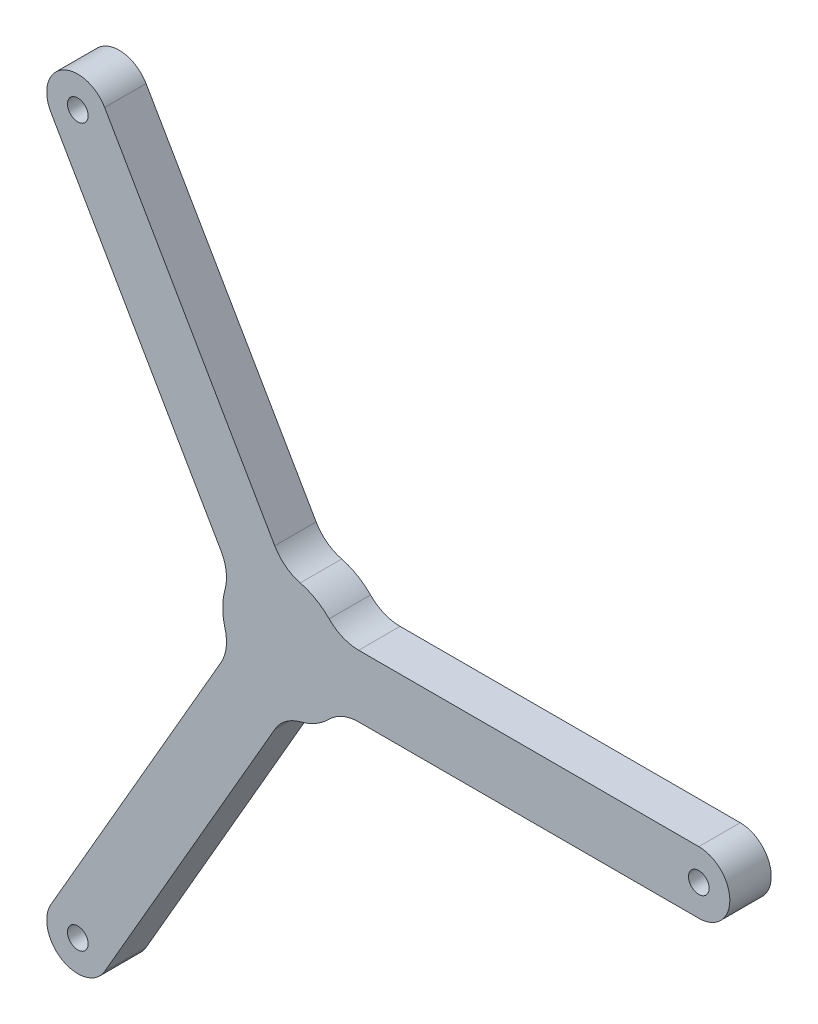
ISO-10303-21;
HEADER;
FILE_DESCRIPTION(('STEP AP214'),'2;1');
FILE_NAME('part.step','',(''),(''),'','','');
FILE_SCHEMA(('AUTOMOTIVE_DESIGN { 1 0 10303 214 1 1 1 1 }'));
ENDSEC;
DATA;
#1=APPLICATION_CONTEXT('core data for automotive mechanical design processes');
#2=APPLICATION_PROTOCOL_DEFINITION('international standard','automotive_design',2000,#1);
#3=PRODUCT_CONTEXT('',#1,'mechanical');
#4=PRODUCT('Part','Part','',(#3));
#5=PRODUCT_RELATED_PRODUCT_CATEGORY('part','',(#4));
#6=PRODUCT_DEFINITION_FORMATION('','',#4);
#7=PRODUCT_DEFINITION_CONTEXT('part definition',#1,'design');
#8=PRODUCT_DEFINITION('design','',#6,#7);
#9=PRODUCT_DEFINITION_SHAPE('','',#8);
#10=(LENGTH_UNIT() NAMED_UNIT(*) SI_UNIT(.MILLI.,.METRE.));
#11=(NAMED_UNIT(*) PLANE_ANGLE_UNIT() SI_UNIT($,.RADIAN.));
#12=(NAMED_UNIT(*) SI_UNIT($,.STERADIAN.) SOLID_ANGLE_UNIT());
#13=UNCERTAINTY_MEASURE_WITH_UNIT(LENGTH_MEASURE(1.E-05),#10,'distance_accuracy_value','');
#14=(GEOMETRIC_REPRESENTATION_CONTEXT(3) GLOBAL_UNCERTAINTY_ASSIGNED_CONTEXT((#13)) GLOBAL_UNIT_ASSIGNED_CONTEXT((#10,
#11,#12)) REPRESENTATION_CONTEXT('',''));
#15=CARTESIAN_POINT('',(0.,0.,0.));
#16=DIRECTION('',(0.,0.,1.));
#17=DIRECTION('',(1.,0.,0.));
#18=AXIS2_PLACEMENT_3D('',#15,#16,#17);
#19=CARTESIAN_POINT('',(0.,0.,10.));
#20=DIRECTION('',(0.,0.,-1.));
#21=DIRECTION('',(-1.,0.,0.));
#22=AXIS2_PLACEMENT_3D('',#19,#20,#21);
#23=CYLINDRICAL_SURFACE('',#22,15.);
#24=DIRECTION('',(0.,0.,-1.));
#25=VECTOR('',#24,1.);
#26=CARTESIAN_POINT('',(-14.4493380611438,-4.02698765763967,10.));
#27=LINE('',#26,#25);
#28=CARTESIAN_POINT('',(-14.4493380611438,-4.02698765763967,0.));
#29=VERTEX_POINT('',#28);
#30=CARTESIAN_POINT('',(-14.4493380611438,-4.02698765763967,10.));
#31=VERTEX_POINT('',#30);
#32=EDGE_CURVE('E59',#29,#31,#27,.F.);
#33=ORIENTED_EDGE('',*,*,#32,.T.);
#34=CARTESIAN_POINT('',(0.,0.,10.));
#35=DIRECTION('',(0.,0.,1.));
#36=DIRECTION('',(1.,0.,0.));
#37=AXIS2_PLACEMENT_3D('',#34,#35,#36);
#38=CIRCLE('',#37,15.);
#39=CARTESIAN_POINT('',(-14.4493380611437,4.02698765763987,10.));
#40=VERTEX_POINT('',#39);
#41=EDGE_CURVE('E277',#40,#31,#38,.T.);
#42=ORIENTED_EDGE('',*,*,#41,.F.);
#43=DIRECTION('',(0.,0.,-1.));
#44=VECTOR('',#43,1.);
#45=CARTESIAN_POINT('',(-14.4493380611437,4.02698765763987,10.));
#46=LINE('',#45,#44);
#47=CARTESIAN_POINT('',(-14.4493380611437,4.02698765763987,0.));
#48=VERTEX_POINT('',#47);
#49=EDGE_CURVE('E205',#40,#48,#46,.T.);
#50=ORIENTED_EDGE('',*,*,#49,.T.);
#51=CARTESIAN_POINT('',(0.,0.,0.));
#52=DIRECTION('',(0.,0.,1.));
#53=DIRECTION('',(1.,0.,0.));
#54=AXIS2_PLACEMENT_3D('',#51,#52,#53);
#55=CIRCLE('',#54,15.);
#56=EDGE_CURVE('E291',#48,#29,#55,.T.);
#57=ORIENTED_EDGE('',*,*,#56,.T.);
#58=EDGE_LOOP('',(#33,#42,#50,#57));
#59=FACE_BOUND('',#58,.T.);
#60=ADVANCED_FACE('F36',(#59),#23,.T.);
#61=DIRECTION('',(0.,0.,-1.));
#62=VECTOR('',#61,1.);
#63=CARTESIAN_POINT('',(3.7371954183296,14.5269876576397,10.));
#64=LINE('',#63,#62);
#65=CARTESIAN_POINT('',(3.7371954183296,14.5269876576397,0.));
#66=VERTEX_POINT('',#65);
#67=CARTESIAN_POINT('',(3.7371954183296,14.5269876576397,10.));
#68=VERTEX_POINT('',#67);
#69=EDGE_CURVE('E172',#66,#68,#64,.F.);
#70=ORIENTED_EDGE('',*,*,#69,.T.);
#71=CARTESIAN_POINT('',(10.7121426428143,10.5,10.));
#72=VERTEX_POINT('',#71);
#73=EDGE_CURVE('E274',#72,#68,#38,.T.);
#74=ORIENTED_EDGE('',*,*,#73,.F.);
#75=DIRECTION('',(0.,0.,-1.));
#76=VECTOR('',#75,1.);
#77=CARTESIAN_POINT('',(10.7121426428143,10.5,10.));
#78=LINE('',#77,#76);
#79=CARTESIAN_POINT('',(10.7121426428143,10.5,0.));
#80=VERTEX_POINT('',#79);
#81=EDGE_CURVE('E300',#72,#80,#78,.T.);
#82=ORIENTED_EDGE('',*,*,#81,.T.);
#83=EDGE_CURVE('E289',#80,#66,#55,.T.);
#84=ORIENTED_EDGE('',*,*,#83,.T.);
#85=EDGE_LOOP('',(#70,#74,#82,#84));
#86=FACE_BOUND('',#85,.T.);
#87=ADVANCED_FACE('F361',(#86),#23,.T.);
#88=CARTESIAN_POINT('',(0.,-7.5,10.));
#89=DIRECTION('',(0.,-1.,0.));
#90=DIRECTION('',(1.,0.,0.));
#91=AXIS2_PLACEMENT_3D('',#88,#89,#90);
#92=PLANE('',#91);
#93=DIRECTION('',(-1.,0.,0.));
#94=VECTOR('',#93,1.);
#95=CARTESIAN_POINT('',(0.,-7.5,10.));
#96=LINE('',#95,#94);
#97=CARTESIAN_POINT('',(100.,-7.5,10.));
#98=VERTEX_POINT('',#97);
#99=CARTESIAN_POINT('',(17.8535710713571,-7.5,10.));
#100=VERTEX_POINT('',#99);
#101=EDGE_CURVE('E265',#98,#100,#96,.T.);
#102=ORIENTED_EDGE('',*,*,#101,.T.);
#103=DIRECTION('',(0.,0.,-1.));
#104=VECTOR('',#103,1.);
#105=CARTESIAN_POINT('',(17.8535710713571,-7.5,10.));
#106=LINE('',#105,#104);
#107=CARTESIAN_POINT('',(17.8535710713571,-7.5,0.));
#108=VERTEX_POINT('',#107);
#109=EDGE_CURVE('E305',#100,#108,#106,.T.);
#110=ORIENTED_EDGE('',*,*,#109,.T.);
#111=DIRECTION('',(-1.,0.,0.));
#112=VECTOR('',#111,1.);
#113=CARTESIAN_POINT('',(0.,-7.5,0.));
#114=LINE('',#113,#112);
#115=CARTESIAN_POINT('',(100.,-7.5,0.));
#116=VERTEX_POINT('',#115);
#117=EDGE_CURVE('E264',#116,#108,#114,.T.);
#118=ORIENTED_EDGE('',*,*,#117,.F.);
#119=DIRECTION('',(0.,0.,-1.));
#120=VECTOR('',#119,1.);
#121=CARTESIAN_POINT('',(100.,-7.5,10.));
#122=LINE('',#121,#120);
#123=EDGE_CURVE('E296',#98,#116,#122,.T.);
#124=ORIENTED_EDGE('',*,*,#123,.F.);
#125=EDGE_LOOP('',(#102,#110,#118,#124));
#126=FACE_BOUND('',#125,.T.);
#127=ADVANCED_FACE('F366',(#126),#92,.T.);
#128=CARTESIAN_POINT('',(100.,0.,10.));
#129=DIRECTION('',(0.,0.,-1.));
#130=DIRECTION('',(-1.,0.,0.));
#131=AXIS2_PLACEMENT_3D('',#128,#129,#130);
#132=CYLINDRICAL_SURFACE('',#131,7.5);
#133=CARTESIAN_POINT('',(100.,0.,0.));
#134=DIRECTION('',(0.,0.,1.));
#135=DIRECTION('',(1.,0.,0.));
#136=AXIS2_PLACEMENT_3D('',#133,#134,#135);
#137=CIRCLE('',#136,7.5);
#138=CARTESIAN_POINT('',(100.,7.5,0.));
#139=VERTEX_POINT('',#138);
#140=EDGE_CURVE('E283',#116,#139,#137,.T.);
#141=ORIENTED_EDGE('',*,*,#140,.T.);
#142=DIRECTION('',(0.,0.,-1.));
#143=VECTOR('',#142,1.);
#144=CARTESIAN_POINT('',(100.,7.5,10.));
#145=LINE('',#144,#143);
#146=CARTESIAN_POINT('',(100.,7.5,10.));
#147=VERTEX_POINT('',#146);
#148=EDGE_CURVE('E280',#147,#139,#145,.T.);
#149=ORIENTED_EDGE('',*,*,#148,.F.);
#150=CARTESIAN_POINT('',(100.,0.,10.));
#151=DIRECTION('',(0.,0.,1.));
#152=DIRECTION('',(1.,0.,0.));
#153=AXIS2_PLACEMENT_3D('',#150,#151,#152);
#154=CIRCLE('',#153,7.5);
#155=EDGE_CURVE('E268',#98,#147,#154,.T.);
#156=ORIENTED_EDGE('',*,*,#155,.F.);
#157=ORIENTED_EDGE('',*,*,#123,.T.);
#158=EDGE_LOOP('',(#141,#149,#156,#157));
#159=FACE_BOUND('',#158,.T.);
#160=ADVANCED_FACE('F378',(#159),#132,.T.);
#161=CARTESIAN_POINT('',(0.,7.5,10.));
#162=DIRECTION('',(0.,1.,0.));
#163=DIRECTION('',(-1.,0.,0.));
#164=AXIS2_PLACEMENT_3D('',#161,#162,#163);
#165=PLANE('',#164);
#166=DIRECTION('',(1.,0.,0.));
#167=VECTOR('',#166,1.);
#168=CARTESIAN_POINT('',(0.,7.5,0.));
#169=LINE('',#168,#167);
#170=CARTESIAN_POINT('',(17.8535710713571,7.5,0.));
#171=VERTEX_POINT('',#170);
#172=EDGE_CURVE('E286',#171,#139,#169,.T.);
#173=ORIENTED_EDGE('',*,*,#172,.F.);
#174=DIRECTION('',(0.,0.,-1.));
#175=VECTOR('',#174,1.);
#176=CARTESIAN_POINT('',(17.8535710713571,7.5,10.));
#177=LINE('',#176,#175);
#178=CARTESIAN_POINT('',(17.8535710713571,7.5,10.));
#179=VERTEX_POINT('',#178);
#180=EDGE_CURVE('E303',#171,#179,#177,.F.);
#181=ORIENTED_EDGE('',*,*,#180,.T.);
#182=DIRECTION('',(1.,0.,0.));
#183=VECTOR('',#182,1.);
#184=CARTESIAN_POINT('',(0.,7.5,10.));
#185=LINE('',#184,#183);
#186=EDGE_CURVE('E272',#179,#147,#185,.T.);
#187=ORIENTED_EDGE('',*,*,#186,.T.);
#188=ORIENTED_EDGE('',*,*,#148,.T.);
#189=EDGE_LOOP('',(#173,#181,#187,#188));
#190=FACE_BOUND('',#189,.T.);
#191=ADVANCED_FACE('F372',(#190),#165,.T.);
#192=CARTESIAN_POINT('',(3.7371954183294,-14.5269876576398,10.));
#193=VERTEX_POINT('',#192);
#194=CARTESIAN_POINT('',(10.7121426428143,-10.5,10.));
#195=VERTEX_POINT('',#194);
#196=EDGE_CURVE('E51',#193,#195,#38,.T.);
#197=ORIENTED_EDGE('',*,*,#196,.F.);
#198=DIRECTION('',(0.,0.,-1.));
#199=VECTOR('',#198,1.);
#200=CARTESIAN_POINT('',(3.7371954183294,-14.5269876576398,10.));
#201=LINE('',#200,#199);
#202=CARTESIAN_POINT('',(3.7371954183294,-14.5269876576398,0.));
#203=VERTEX_POINT('',#202);
#204=EDGE_CURVE('E248',#193,#203,#201,.T.);
#205=ORIENTED_EDGE('',*,*,#204,.T.);
#206=CARTESIAN_POINT('',(10.7121426428143,-10.5,0.));
#207=VERTEX_POINT('',#206);
#208=EDGE_CURVE('E288',#203,#207,#55,.T.);
#209=ORIENTED_EDGE('',*,*,#208,.T.);
#210=DIRECTION('',(0.,0.,-1.));
#211=VECTOR('',#210,1.);
#212=CARTESIAN_POINT('',(10.7121426428143,-10.5,10.));
#213=LINE('',#212,#211);
#214=EDGE_CURVE('E298',#207,#195,#213,.F.);
#215=ORIENTED_EDGE('',*,*,#214,.T.);
#216=EDGE_LOOP('',(#197,#205,#209,#215));
#217=FACE_BOUND('',#216,.T.);
#218=ADVANCED_FACE('F324',(#217),#23,.T.);
#219=CARTESIAN_POINT('',(100.,0.,10.));
#220=DIRECTION('',(0.,0.,-1.));
#221=DIRECTION('',(-1.,0.,0.));
#222=AXIS2_PLACEMENT_3D('',#219,#220,#221);
#223=CYLINDRICAL_SURFACE('',#222,2.5);
#224=CARTESIAN_POINT('',(100.,0.,10.));
#225=DIRECTION('',(0.,0.,1.));
#226=DIRECTION('',(1.,0.,0.));
#227=AXIS2_PLACEMENT_3D('',#224,#225,#226);
#228=CIRCLE('',#227,2.5);
#229=CARTESIAN_POINT('',(102.5,0.,10.));
#230=VERTEX_POINT('',#229);
#231=EDGE_CURVE('E276',#230,#230,#228,.T.);
#232=ORIENTED_EDGE('',*,*,#231,.T.);
#233=EDGE_LOOP('',(#232));
#234=FACE_BOUND('',#233,.T.);
#235=CARTESIAN_POINT('',(100.,0.,0.));
#236=DIRECTION('',(0.,0.,1.));
#237=DIRECTION('',(1.,0.,0.));
#238=AXIS2_PLACEMENT_3D('',#235,#236,#237);
#239=CIRCLE('',#238,2.5);
#240=CARTESIAN_POINT('',(102.5,0.,0.));
#241=VERTEX_POINT('',#240);
#242=EDGE_CURVE('E269',#241,#241,#239,.T.);
#243=ORIENTED_EDGE('',*,*,#242,.F.);
#244=EDGE_LOOP('',(#243));
#245=FACE_BOUND('',#244,.T.);
#246=ADVANCED_FACE('F371',(#234,#245),#223,.F.);
#247=CARTESIAN_POINT('',(0.,0.,10.));
#248=DIRECTION('',(0.,0.,1.));
#249=DIRECTION('',(1.,0.,0.));
#250=AXIS2_PLACEMENT_3D('',#247,#248,#249);
#251=PLANE('',#250);
#252=ORIENTED_EDGE('',*,*,#196,.T.);
#253=CARTESIAN_POINT('',(17.8535710713571,-17.5,10.));
#254=DIRECTION('',(0.,0.,1.));
#255=DIRECTION('',(1.,0.,0.));
#256=AXIS2_PLACEMENT_3D('',#253,#254,#255);
#257=CIRCLE('',#256,10.);
#258=EDGE_CURVE('E11',#195,#100,#257,.F.);
#259=ORIENTED_EDGE('',*,*,#258,.T.);
#260=ORIENTED_EDGE('',*,*,#101,.F.);
#261=ORIENTED_EDGE('',*,*,#155,.T.);
#262=ORIENTED_EDGE('',*,*,#186,.F.);
#263=CARTESIAN_POINT('',(17.8535710713571,17.5,10.));
#264=DIRECTION('',(0.,0.,1.));
#265=DIRECTION('',(1.,0.,0.));
#266=AXIS2_PLACEMENT_3D('',#263,#264,#265);
#267=CIRCLE('',#266,10.);
#268=EDGE_CURVE('E310',#179,#72,#267,.F.);
#269=ORIENTED_EDGE('',*,*,#268,.T.);
#270=ORIENTED_EDGE('',*,*,#73,.T.);
#271=CARTESIAN_POINT('',(6.22865903054934,24.2116460960662,10.));
#272=DIRECTION('',(0.,0.,1.));
#273=DIRECTION('',(-0.499999999999992,0.866025403784443,0.));
#274=AXIS2_PLACEMENT_3D('',#271,#272,#273);
#275=CIRCLE('',#274,10.);
#276=CARTESIAN_POINT('',(-2.43159500729509,19.2116460960663,10.));
#277=VERTEX_POINT('',#276);
#278=EDGE_CURVE('E188',#68,#277,#275,.F.);
#279=ORIENTED_EDGE('',*,*,#278,.T.);
#280=DIRECTION('',(0.499999999999992,-0.866025403784443,0.));
#281=VECTOR('',#280,1.);
#282=CARTESIAN_POINT('',(6.49519052838332,3.74999999999994,10.));
#283=LINE('',#282,#281);
#284=CARTESIAN_POINT('',(-43.5048094716159,90.3525403784443,10.));
#285=VERTEX_POINT('',#284);
#286=EDGE_CURVE('E165',#285,#277,#283,.T.);
#287=ORIENTED_EDGE('',*,*,#286,.F.);
#288=CARTESIAN_POINT('',(-49.9999999999992,86.6025403784443,10.));
#289=DIRECTION('',(0.,0.,1.));
#290=DIRECTION('',(-0.499999999999992,0.866025403784443,0.));
#291=AXIS2_PLACEMENT_3D('',#288,#289,#290);
#292=CIRCLE('',#291,7.5);
#293=CARTESIAN_POINT('',(-56.4951905283825,82.8525403784444,10.));
#294=VERTEX_POINT('',#293);
#295=EDGE_CURVE('E177',#285,#294,#292,.T.);
#296=ORIENTED_EDGE('',*,*,#295,.T.);
#297=DIRECTION('',(-0.499999999999992,0.866025403784443,0.));
#298=VECTOR('',#297,1.);
#299=CARTESIAN_POINT('',(-6.49519052838332,-3.74999999999994,10.));
#300=LINE('',#299,#298);
#301=CARTESIAN_POINT('',(-15.4219760640617,11.7116460960664,10.));
#302=VERTEX_POINT('',#301);
#303=EDGE_CURVE('E182',#302,#294,#300,.T.);
#304=ORIENTED_EDGE('',*,*,#303,.F.);
#305=CARTESIAN_POINT('',(-24.0822301019062,6.71164609606645,10.));
#306=DIRECTION('',(0.,0.,1.));
#307=DIRECTION('',(-0.499999999999992,0.866025403784443,0.));
#308=AXIS2_PLACEMENT_3D('',#305,#306,#307);
#309=CIRCLE('',#308,10.);
#310=EDGE_CURVE('E213',#302,#40,#309,.F.);
#311=ORIENTED_EDGE('',*,*,#310,.T.);
#312=ORIENTED_EDGE('',*,*,#41,.T.);
#313=CARTESIAN_POINT('',(-24.0822301019063,-6.71164609606612,10.));
#314=DIRECTION('',(0.,0.,1.));
#315=DIRECTION('',(-0.500000000000004,-0.866025403784436,0.));
#316=AXIS2_PLACEMENT_3D('',#313,#314,#315);
#317=CIRCLE('',#316,10.);
#318=CARTESIAN_POINT('',(-15.4219760640619,-11.7116460960662,10.));
#319=VERTEX_POINT('',#318);
#320=EDGE_CURVE('E262',#31,#319,#317,.F.);
#321=ORIENTED_EDGE('',*,*,#320,.T.);
#322=DIRECTION('',(0.500000000000004,0.866025403784436,0.));
#323=VECTOR('',#322,1.);
#324=CARTESIAN_POINT('',(-6.49519052838327,3.75000000000003,10.));
#325=LINE('',#324,#323);
#326=CARTESIAN_POINT('',(-56.4951905283837,-82.8525403784436,10.));
#327=VERTEX_POINT('',#326);
#328=EDGE_CURVE('E221',#327,#319,#325,.T.);
#329=ORIENTED_EDGE('',*,*,#328,.F.);
#330=CARTESIAN_POINT('',(-50.0000000000004,-86.6025403784437,10.));
#331=DIRECTION('',(0.,0.,1.));
#332=DIRECTION('',(-0.500000000000004,-0.866025403784436,0.));
#333=AXIS2_PLACEMENT_3D('',#330,#331,#332);
#334=CIRCLE('',#333,7.5);
#335=CARTESIAN_POINT('',(-43.5048094716171,-90.3525403784437,10.));
#336=VERTEX_POINT('',#335);
#337=EDGE_CURVE('E224',#327,#336,#334,.T.);
#338=ORIENTED_EDGE('',*,*,#337,.T.);
#339=DIRECTION('',(-0.500000000000004,-0.866025403784436,0.));
#340=VECTOR('',#339,1.);
#341=CARTESIAN_POINT('',(6.49519052838327,-3.75000000000003,10.));
#342=LINE('',#341,#340);
#343=CARTESIAN_POINT('',(-2.43159500729536,-19.2116460960662,10.));
#344=VERTEX_POINT('',#343);
#345=EDGE_CURVE('E228',#344,#336,#342,.T.);
#346=ORIENTED_EDGE('',*,*,#345,.F.);
#347=CARTESIAN_POINT('',(6.228659030549,-24.2116460960663,10.));
#348=DIRECTION('',(0.,0.,1.));
#349=DIRECTION('',(-0.500000000000004,-0.866025403784436,0.));
#350=AXIS2_PLACEMENT_3D('',#347,#348,#349);
#351=CIRCLE('',#350,10.);
#352=EDGE_CURVE('E257',#344,#193,#351,.F.);
#353=ORIENTED_EDGE('',*,*,#352,.T.);
#354=EDGE_LOOP('',(#252,#259,#260,#261,#262,#269,#270,#279,#287,#296,#304,#311,#312,#321,#329,
#338,#346,#353));
#355=FACE_BOUND('',#354,.T.);
#356=ORIENTED_EDGE('',*,*,#231,.F.);
#357=EDGE_LOOP('',(#356));
#358=FACE_BOUND('',#357,.T.);
#359=CARTESIAN_POINT('',(-50.0000000000004,-86.6025403784437,10.));
#360=DIRECTION('',(0.,0.,1.));
#361=DIRECTION('',(-0.500000000000004,-0.866025403784436,0.));
#362=AXIS2_PLACEMENT_3D('',#359,#360,#361);
#363=CIRCLE('',#362,2.5);
#364=CARTESIAN_POINT('',(-51.2500000000004,-88.7676038879048,10.));
#365=VERTEX_POINT('',#364);
#366=EDGE_CURVE('E230',#365,#365,#363,.T.);
#367=ORIENTED_EDGE('',*,*,#366,.F.);
#368=EDGE_LOOP('',(#367));
#369=FACE_BOUND('',#368,.T.);
#370=CARTESIAN_POINT('',(-49.9999999999992,86.6025403784443,10.));
#371=DIRECTION('',(0.,0.,1.));
#372=DIRECTION('',(-0.499999999999992,0.866025403784443,0.));
#373=AXIS2_PLACEMENT_3D('',#370,#371,#372);
#374=CIRCLE('',#373,2.5);
#375=CARTESIAN_POINT('',(-51.2499999999992,88.7676038879054,10.));
#376=VERTEX_POINT('',#375);
#377=EDGE_CURVE('E196',#376,#376,#374,.T.);
#378=ORIENTED_EDGE('',*,*,#377,.F.);
#379=EDGE_LOOP('',(#378));
#380=FACE_BOUND('',#379,.T.);
#381=ADVANCED_FACE('F184',(#355,#358,#369,#380),#251,.T.);
#382=CARTESIAN_POINT('',(0.,0.,0.));
#383=DIRECTION('',(0.,0.,1.));
#384=DIRECTION('',(1.,0.,0.));
#385=AXIS2_PLACEMENT_3D('',#382,#383,#384);
#386=PLANE('',#385);
#387=ORIENTED_EDGE('',*,*,#83,.F.);
#388=CARTESIAN_POINT('',(17.8535710713571,17.5,0.));
#389=DIRECTION('',(0.,0.,1.));
#390=DIRECTION('',(1.,0.,0.));
#391=AXIS2_PLACEMENT_3D('',#388,#389,#390);
#392=CIRCLE('',#391,10.);
#393=EDGE_CURVE('E308',#80,#171,#392,.T.);
#394=ORIENTED_EDGE('',*,*,#393,.T.);
#395=ORIENTED_EDGE('',*,*,#172,.T.);
#396=ORIENTED_EDGE('',*,*,#140,.F.);
#397=ORIENTED_EDGE('',*,*,#117,.T.);
#398=CARTESIAN_POINT('',(17.8535710713571,-17.5,0.));
#399=DIRECTION('',(0.,0.,1.));
#400=DIRECTION('',(1.,0.,0.));
#401=AXIS2_PLACEMENT_3D('',#398,#399,#400);
#402=CIRCLE('',#401,10.);
#403=EDGE_CURVE('E44',#108,#207,#402,.T.);
#404=ORIENTED_EDGE('',*,*,#403,.T.);
#405=ORIENTED_EDGE('',*,*,#208,.F.);
#406=CARTESIAN_POINT('',(6.228659030549,-24.2116460960663,0.));
#407=DIRECTION('',(0.,0.,1.));
#408=DIRECTION('',(-0.500000000000004,-0.866025403784436,0.));
#409=AXIS2_PLACEMENT_3D('',#406,#407,#408);
#410=CIRCLE('',#409,10.);
#411=CARTESIAN_POINT('',(-2.43159500729536,-19.2116460960662,0.));
#412=VERTEX_POINT('',#411);
#413=EDGE_CURVE('E255',#203,#412,#410,.T.);
#414=ORIENTED_EDGE('',*,*,#413,.T.);
#415=DIRECTION('',(-0.500000000000004,-0.866025403784436,0.));
#416=VECTOR('',#415,1.);
#417=CARTESIAN_POINT('',(6.49519052838327,-3.75000000000003,0.));
#418=LINE('',#417,#416);
#419=CARTESIAN_POINT('',(-43.5048094716171,-90.3525403784437,0.));
#420=VERTEX_POINT('',#419);
#421=EDGE_CURVE('E239',#412,#420,#418,.T.);
#422=ORIENTED_EDGE('',*,*,#421,.T.);
#423=CARTESIAN_POINT('',(-50.0000000000004,-86.6025403784437,0.));
#424=DIRECTION('',(0.,0.,1.));
#425=DIRECTION('',(-0.500000000000004,-0.866025403784436,0.));
#426=AXIS2_PLACEMENT_3D('',#423,#424,#425);
#427=CIRCLE('',#426,7.5);
#428=CARTESIAN_POINT('',(-56.4951905283837,-82.8525403784436,0.));
#429=VERTEX_POINT('',#428);
#430=EDGE_CURVE('E236',#429,#420,#427,.T.);
#431=ORIENTED_EDGE('',*,*,#430,.F.);
#432=DIRECTION('',(0.500000000000004,0.866025403784436,0.));
#433=VECTOR('',#432,1.);
#434=CARTESIAN_POINT('',(-6.49519052838327,3.75000000000003,0.));
#435=LINE('',#434,#433);
#436=CARTESIAN_POINT('',(-15.4219760640619,-11.7116460960662,0.));
#437=VERTEX_POINT('',#436);
#438=EDGE_CURVE('E220',#429,#437,#435,.T.);
#439=ORIENTED_EDGE('',*,*,#438,.T.);
#440=CARTESIAN_POINT('',(-24.0822301019063,-6.71164609606612,0.));
#441=DIRECTION('',(0.,0.,1.));
#442=DIRECTION('',(-0.500000000000004,-0.866025403784436,0.));
#443=AXIS2_PLACEMENT_3D('',#440,#441,#442);
#444=CIRCLE('',#443,10.);
#445=EDGE_CURVE('E259',#437,#29,#444,.T.);
#446=ORIENTED_EDGE('',*,*,#445,.T.);
#447=ORIENTED_EDGE('',*,*,#56,.F.);
#448=CARTESIAN_POINT('',(-24.0822301019062,6.71164609606645,0.));
#449=DIRECTION('',(0.,0.,1.));
#450=DIRECTION('',(-0.499999999999992,0.866025403784443,0.));
#451=AXIS2_PLACEMENT_3D('',#448,#449,#450);
#452=CIRCLE('',#451,10.);
#453=CARTESIAN_POINT('',(-15.4219760640617,11.7116460960664,0.));
#454=VERTEX_POINT('',#453);
#455=EDGE_CURVE('E211',#48,#454,#452,.T.);
#456=ORIENTED_EDGE('',*,*,#455,.T.);
#457=DIRECTION('',(-0.499999999999992,0.866025403784443,0.));
#458=VECTOR('',#457,1.);
#459=CARTESIAN_POINT('',(-6.49519052838332,-3.74999999999994,0.));
#460=LINE('',#459,#458);
#461=CARTESIAN_POINT('',(-56.4951905283825,82.8525403784444,0.));
#462=VERTEX_POINT('',#461);
#463=EDGE_CURVE('E192',#454,#462,#460,.T.);
#464=ORIENTED_EDGE('',*,*,#463,.T.);
#465=CARTESIAN_POINT('',(-49.9999999999992,86.6025403784443,0.));
#466=DIRECTION('',(0.,0.,1.));
#467=DIRECTION('',(-0.499999999999992,0.866025403784443,0.));
#468=AXIS2_PLACEMENT_3D('',#465,#466,#467);
#469=CIRCLE('',#468,7.5);
#470=CARTESIAN_POINT('',(-43.5048094716159,90.3525403784443,0.));
#471=VERTEX_POINT('',#470);
#472=EDGE_CURVE('E200',#471,#462,#469,.T.);
#473=ORIENTED_EDGE('',*,*,#472,.F.);
#474=DIRECTION('',(0.499999999999992,-0.866025403784443,0.));
#475=VECTOR('',#474,1.);
#476=CARTESIAN_POINT('',(6.49519052838332,3.74999999999994,0.));
#477=LINE('',#476,#475);
#478=CARTESIAN_POINT('',(-2.43159500729509,19.2116460960663,0.));
#479=VERTEX_POINT('',#478);
#480=EDGE_CURVE('E168',#471,#479,#477,.T.);
#481=ORIENTED_EDGE('',*,*,#480,.T.);
#482=CARTESIAN_POINT('',(6.22865903054934,24.2116460960662,0.));
#483=DIRECTION('',(0.,0.,1.));
#484=DIRECTION('',(-0.499999999999992,0.866025403784443,0.));
#485=AXIS2_PLACEMENT_3D('',#482,#483,#484);
#486=CIRCLE('',#485,10.);
#487=EDGE_CURVE('E216',#479,#66,#486,.T.);
#488=ORIENTED_EDGE('',*,*,#487,.T.);
#489=EDGE_LOOP('',(#387,#394,#395,#396,#397,#404,#405,#414,#422,#431,#439,#446,#447,#456,#464,
#473,#481,#488));
#490=FACE_BOUND('',#489,.T.);
#491=ORIENTED_EDGE('',*,*,#242,.T.);
#492=EDGE_LOOP('',(#491));
#493=FACE_BOUND('',#492,.T.);
#494=CARTESIAN_POINT('',(-50.0000000000004,-86.6025403784437,0.));
#495=DIRECTION('',(0.,0.,1.));
#496=DIRECTION('',(-0.500000000000004,-0.866025403784436,0.));
#497=AXIS2_PLACEMENT_3D('',#494,#495,#496);
#498=CIRCLE('',#497,2.5);
#499=CARTESIAN_POINT('',(-51.2500000000004,-88.7676038879048,0.));
#500=VERTEX_POINT('',#499);
#501=EDGE_CURVE('E225',#500,#500,#498,.T.);
#502=ORIENTED_EDGE('',*,*,#501,.T.);
#503=EDGE_LOOP('',(#502));
#504=FACE_BOUND('',#503,.T.);
#505=CARTESIAN_POINT('',(-49.9999999999992,86.6025403784443,0.));
#506=DIRECTION('',(0.,0.,1.));
#507=DIRECTION('',(-0.499999999999992,0.866025403784443,0.));
#508=AXIS2_PLACEMENT_3D('',#505,#506,#507);
#509=CIRCLE('',#508,2.5);
#510=CARTESIAN_POINT('',(-51.2499999999992,88.7676038879054,0.));
#511=VERTEX_POINT('',#510);
#512=EDGE_CURVE('E189',#511,#511,#509,.T.);
#513=ORIENTED_EDGE('',*,*,#512,.T.);
#514=EDGE_LOOP('',(#513));
#515=FACE_BOUND('',#514,.T.);
#516=ADVANCED_FACE('F316',(#490,#493,#504,#515),#386,.F.);
#517=CARTESIAN_POINT('',(17.8535710713571,17.5,10.));
#518=DIRECTION('',(0.,0.,-1.));
#519=DIRECTION('',(-1.,0.,0.));
#520=AXIS2_PLACEMENT_3D('',#517,#518,#519);
#521=CYLINDRICAL_SURFACE('',#520,10.);
#522=ORIENTED_EDGE('',*,*,#268,.F.);
#523=ORIENTED_EDGE('',*,*,#180,.F.);
#524=ORIENTED_EDGE('',*,*,#393,.F.);
#525=ORIENTED_EDGE('',*,*,#81,.F.);
#526=EDGE_LOOP('',(#522,#523,#524,#525));
#527=FACE_BOUND('',#526,.T.);
#528=ADVANCED_FACE('F389',(#527),#521,.F.);
#529=CARTESIAN_POINT('',(17.8535710713571,-17.5,10.));
#530=DIRECTION('',(0.,0.,-1.));
#531=DIRECTION('',(-1.,0.,0.));
#532=AXIS2_PLACEMENT_3D('',#529,#530,#531);
#533=CYLINDRICAL_SURFACE('',#532,10.);
#534=ORIENTED_EDGE('',*,*,#258,.F.);
#535=ORIENTED_EDGE('',*,*,#214,.F.);
#536=ORIENTED_EDGE('',*,*,#403,.F.);
#537=ORIENTED_EDGE('',*,*,#109,.F.);
#538=EDGE_LOOP('',(#534,#535,#536,#537));
#539=FACE_BOUND('',#538,.T.);
#540=ADVANCED_FACE('F38',(#539),#533,.F.);
#541=CARTESIAN_POINT('',(6.22865903054934,24.2116460960662,10.));
#542=DIRECTION('',(0.,0.,-1.));
#543=DIRECTION('',(0.499999999999992,-0.866025403784443,0.));
#544=AXIS2_PLACEMENT_3D('',#541,#542,#543);
#545=CYLINDRICAL_SURFACE('',#544,10.);
#546=ORIENTED_EDGE('',*,*,#278,.F.);
#547=ORIENTED_EDGE('',*,*,#69,.F.);
#548=ORIENTED_EDGE('',*,*,#487,.F.);
#549=DIRECTION('',(0.,0.,-1.));
#550=VECTOR('',#549,1.);
#551=CARTESIAN_POINT('',(-2.43159500729509,19.2116460960663,10.));
#552=LINE('',#551,#550);
#553=EDGE_CURVE('E209',#277,#479,#552,.T.);
#554=ORIENTED_EDGE('',*,*,#553,.F.);
#555=EDGE_LOOP('',(#546,#547,#548,#554));
#556=FACE_BOUND('',#555,.T.);
#557=ADVANCED_FACE('F396',(#556),#545,.F.);
#558=CARTESIAN_POINT('',(-24.0822301019062,6.71164609606645,10.));
#559=DIRECTION('',(0.,0.,-1.));
#560=DIRECTION('',(0.499999999999992,-0.866025403784443,0.));
#561=AXIS2_PLACEMENT_3D('',#558,#559,#560);
#562=CYLINDRICAL_SURFACE('',#561,10.);
#563=ORIENTED_EDGE('',*,*,#310,.F.);
#564=DIRECTION('',(0.,0.,-1.));
#565=VECTOR('',#564,1.);
#566=CARTESIAN_POINT('',(-15.4219760640617,11.7116460960664,10.));
#567=LINE('',#566,#565);
#568=EDGE_CURVE('E207',#454,#302,#567,.F.);
#569=ORIENTED_EDGE('',*,*,#568,.F.);
#570=ORIENTED_EDGE('',*,*,#455,.F.);
#571=ORIENTED_EDGE('',*,*,#49,.F.);
#572=EDGE_LOOP('',(#563,#569,#570,#571));
#573=FACE_BOUND('',#572,.T.);
#574=ADVANCED_FACE('F411',(#573),#562,.F.);
#575=CARTESIAN_POINT('',(-49.9999999999992,86.6025403784443,10.));
#576=DIRECTION('',(0.,0.,-1.));
#577=DIRECTION('',(0.499999999999992,-0.866025403784443,0.));
#578=AXIS2_PLACEMENT_3D('',#575,#576,#577);
#579=CYLINDRICAL_SURFACE('',#578,2.5);
#580=ORIENTED_EDGE('',*,*,#377,.T.);
#581=EDGE_LOOP('',(#580));
#582=FACE_BOUND('',#581,.T.);
#583=ORIENTED_EDGE('',*,*,#512,.F.);
#584=EDGE_LOOP('',(#583));
#585=FACE_BOUND('',#584,.T.);
#586=ADVANCED_FACE('F413',(#582,#585),#579,.F.);
#587=CARTESIAN_POINT('',(-6.49519052838332,-3.74999999999994,10.));
#588=DIRECTION('',(-0.866025403784443,-0.499999999999992,0.));
#589=DIRECTION('',(0.499999999999992,-0.866025403784443,0.));
#590=AXIS2_PLACEMENT_3D('',#587,#588,#589);
#591=PLANE('',#590);
#592=ORIENTED_EDGE('',*,*,#463,.F.);
#593=ORIENTED_EDGE('',*,*,#568,.T.);
#594=ORIENTED_EDGE('',*,*,#303,.T.);
#595=DIRECTION('',(0.,0.,-1.));
#596=VECTOR('',#595,1.);
#597=CARTESIAN_POINT('',(-56.4951905283825,82.8525403784444,10.));
#598=LINE('',#597,#596);
#599=EDGE_CURVE('E173',#294,#462,#598,.T.);
#600=ORIENTED_EDGE('',*,*,#599,.T.);
#601=EDGE_LOOP('',(#592,#593,#594,#600));
#602=FACE_BOUND('',#601,.T.);
#603=ADVANCED_FACE('F408',(#602),#591,.T.);
#604=CARTESIAN_POINT('',(-49.9999999999992,86.6025403784443,10.));
#605=DIRECTION('',(0.,0.,-1.));
#606=DIRECTION('',(0.499999999999992,-0.866025403784443,0.));
#607=AXIS2_PLACEMENT_3D('',#604,#605,#606);
#608=CYLINDRICAL_SURFACE('',#607,7.5);
#609=ORIENTED_EDGE('',*,*,#472,.T.);
#610=ORIENTED_EDGE('',*,*,#599,.F.);
#611=ORIENTED_EDGE('',*,*,#295,.F.);
#612=DIRECTION('',(0.,0.,-1.));
#613=VECTOR('',#612,1.);
#614=CARTESIAN_POINT('',(-43.5048094716159,90.3525403784443,10.));
#615=LINE('',#614,#613);
#616=EDGE_CURVE('E160',#285,#471,#615,.T.);
#617=ORIENTED_EDGE('',*,*,#616,.T.);
#618=EDGE_LOOP('',(#609,#610,#611,#617));
#619=FACE_BOUND('',#618,.T.);
#620=ADVANCED_FACE('F178',(#619),#608,.T.);
#621=CARTESIAN_POINT('',(6.49519052838332,3.74999999999994,10.));
#622=DIRECTION('',(0.866025403784443,0.499999999999992,0.));
#623=DIRECTION('',(-0.499999999999992,0.866025403784443,0.));
#624=AXIS2_PLACEMENT_3D('',#621,#622,#623);
#625=PLANE('',#624);
#626=ORIENTED_EDGE('',*,*,#286,.T.);
#627=ORIENTED_EDGE('',*,*,#553,.T.);
#628=ORIENTED_EDGE('',*,*,#480,.F.);
#629=ORIENTED_EDGE('',*,*,#616,.F.);
#630=EDGE_LOOP('',(#626,#627,#628,#629));
#631=FACE_BOUND('',#630,.T.);
#632=ADVANCED_FACE('F162',(#631),#625,.T.);
#633=CARTESIAN_POINT('',(-6.49519052838327,3.75000000000003,10.));
#634=DIRECTION('',(-0.866025403784436,0.500000000000004,0.));
#635=DIRECTION('',(-0.500000000000004,-0.866025403784436,0.));
#636=AXIS2_PLACEMENT_3D('',#633,#634,#635);
#637=PLANE('',#636);
#638=ORIENTED_EDGE('',*,*,#328,.T.);
#639=DIRECTION('',(0.,0.,-1.));
#640=VECTOR('',#639,1.);
#641=CARTESIAN_POINT('',(-15.4219760640619,-11.7116460960662,10.));
#642=LINE('',#641,#640);
#643=EDGE_CURVE('E252',#319,#437,#642,.T.);
#644=ORIENTED_EDGE('',*,*,#643,.T.);
#645=ORIENTED_EDGE('',*,*,#438,.F.);
#646=DIRECTION('',(0.,0.,-1.));
#647=VECTOR('',#646,1.);
#648=CARTESIAN_POINT('',(-56.4951905283837,-82.8525403784436,10.));
#649=LINE('',#648,#647);
#650=EDGE_CURVE('E245',#327,#429,#649,.T.);
#651=ORIENTED_EDGE('',*,*,#650,.F.);
#652=EDGE_LOOP('',(#638,#644,#645,#651));
#653=FACE_BOUND('',#652,.T.);
#654=ADVANCED_FACE('F337',(#653),#637,.T.);
#655=CARTESIAN_POINT('',(-50.0000000000004,-86.6025403784437,10.));
#656=DIRECTION('',(0.,0.,-1.));
#657=DIRECTION('',(0.500000000000004,0.866025403784436,0.));
#658=AXIS2_PLACEMENT_3D('',#655,#656,#657);
#659=CYLINDRICAL_SURFACE('',#658,7.5);
#660=ORIENTED_EDGE('',*,*,#430,.T.);
#661=DIRECTION('',(0.,0.,-1.));
#662=VECTOR('',#661,1.);
#663=CARTESIAN_POINT('',(-43.5048094716171,-90.3525403784437,10.));
#664=LINE('',#663,#662);
#665=EDGE_CURVE('E233',#336,#420,#664,.T.);
#666=ORIENTED_EDGE('',*,*,#665,.F.);
#667=ORIENTED_EDGE('',*,*,#337,.F.);
#668=ORIENTED_EDGE('',*,*,#650,.T.);
#669=EDGE_LOOP('',(#660,#666,#667,#668));
#670=FACE_BOUND('',#669,.T.);
#671=ADVANCED_FACE('F341',(#670),#659,.T.);
#672=CARTESIAN_POINT('',(6.49519052838327,-3.75000000000003,10.));
#673=DIRECTION('',(0.866025403784436,-0.500000000000004,0.));
#674=DIRECTION('',(0.500000000000004,0.866025403784436,0.));
#675=AXIS2_PLACEMENT_3D('',#672,#673,#674);
#676=PLANE('',#675);
#677=ORIENTED_EDGE('',*,*,#421,.F.);
#678=DIRECTION('',(0.,0.,-1.));
#679=VECTOR('',#678,1.);
#680=CARTESIAN_POINT('',(-2.43159500729536,-19.2116460960662,10.));
#681=LINE('',#680,#679);
#682=EDGE_CURVE('E250',#412,#344,#681,.F.);
#683=ORIENTED_EDGE('',*,*,#682,.T.);
#684=ORIENTED_EDGE('',*,*,#345,.T.);
#685=ORIENTED_EDGE('',*,*,#665,.T.);
#686=EDGE_LOOP('',(#677,#683,#684,#685));
#687=FACE_BOUND('',#686,.T.);
#688=ADVANCED_FACE('F349',(#687),#676,.T.);
#689=CARTESIAN_POINT('',(-50.0000000000004,-86.6025403784437,10.));
#690=DIRECTION('',(0.,0.,-1.));
#691=DIRECTION('',(0.500000000000004,0.866025403784436,0.));
#692=AXIS2_PLACEMENT_3D('',#689,#690,#691);
#693=CYLINDRICAL_SURFACE('',#692,2.5);
#694=ORIENTED_EDGE('',*,*,#366,.T.);
#695=EDGE_LOOP('',(#694));
#696=FACE_BOUND('',#695,.T.);
#697=ORIENTED_EDGE('',*,*,#501,.F.);
#698=EDGE_LOOP('',(#697));
#699=FACE_BOUND('',#698,.T.);
#700=ADVANCED_FACE('F351',(#696,#699),#693,.F.);
#701=CARTESIAN_POINT('',(6.228659030549,-24.2116460960663,10.));
#702=DIRECTION('',(0.,0.,-1.));
#703=DIRECTION('',(0.500000000000004,0.866025403784436,0.));
#704=AXIS2_PLACEMENT_3D('',#701,#702,#703);
#705=CYLINDRICAL_SURFACE('',#704,10.);
#706=ORIENTED_EDGE('',*,*,#352,.F.);
#707=ORIENTED_EDGE('',*,*,#682,.F.);
#708=ORIENTED_EDGE('',*,*,#413,.F.);
#709=ORIENTED_EDGE('',*,*,#204,.F.);
#710=EDGE_LOOP('',(#706,#707,#708,#709));
#711=FACE_BOUND('',#710,.T.);
#712=ADVANCED_FACE('F347',(#711),#705,.F.);
#713=CARTESIAN_POINT('',(-24.0822301019063,-6.71164609606612,10.));
#714=DIRECTION('',(0.,0.,-1.));
#715=DIRECTION('',(0.500000000000004,0.866025403784436,0.));
#716=AXIS2_PLACEMENT_3D('',#713,#714,#715);
#717=CYLINDRICAL_SURFACE('',#716,10.);
#718=ORIENTED_EDGE('',*,*,#320,.F.);
#719=ORIENTED_EDGE('',*,*,#32,.F.);
#720=ORIENTED_EDGE('',*,*,#445,.F.);
#721=ORIENTED_EDGE('',*,*,#643,.F.);
#722=EDGE_LOOP('',(#718,#719,#720,#721));
#723=FACE_BOUND('',#722,.T.);
#724=ADVANCED_FACE('F334',(#723),#717,.F.);
#725=CLOSED_SHELL('',(#60,#87,#127,#160,#191,#218,#246,#381,#516,#528,#540,#557,#574,#586,#603,
#620,#632,#654,#671,#688,#700,#712,#724));
#726=MANIFOLD_SOLID_BREP('B2',#725);
#727=ADVANCED_BREP_SHAPE_REPRESENTATION('',(#18,#726),#14);
#728=SHAPE_DEFINITION_REPRESENTATION(#9,#727);
ENDSEC;
END-ISO-10303-21;
